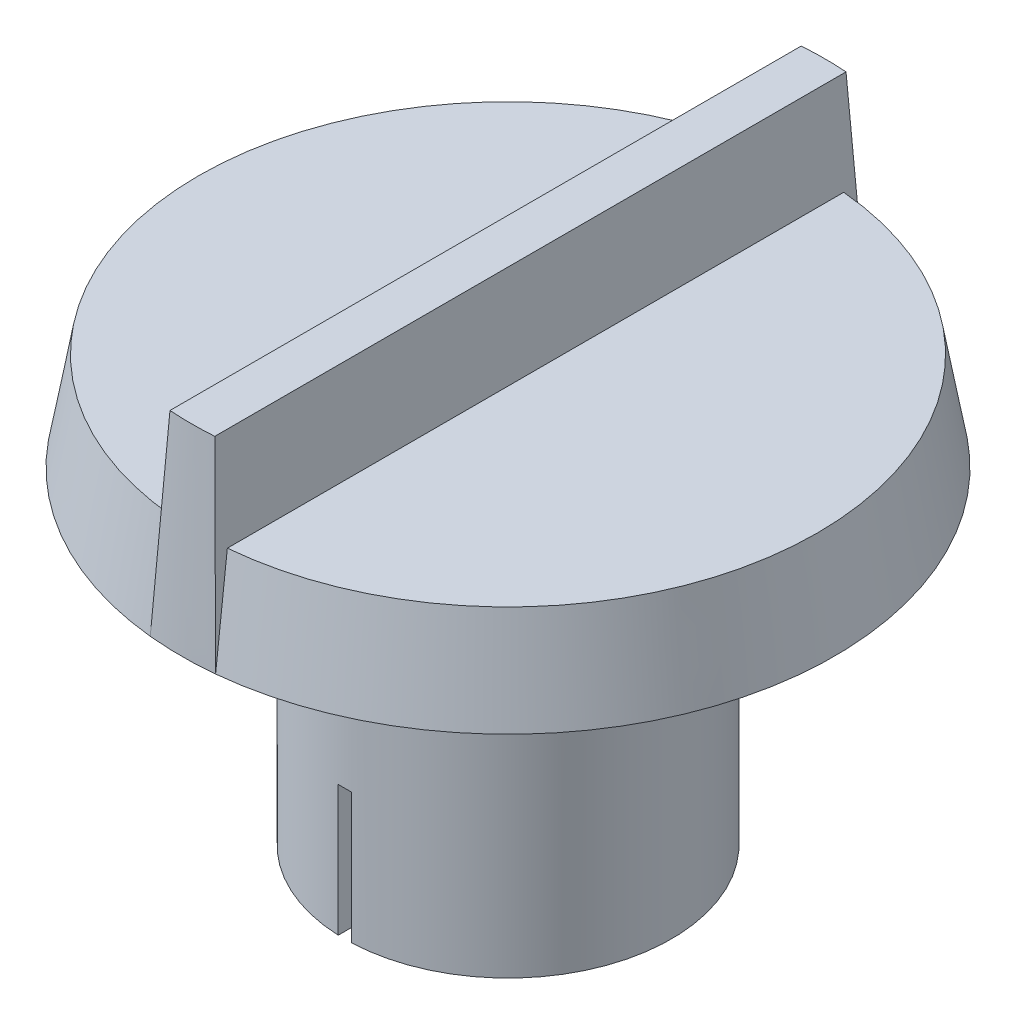
ISO-10303-21;
HEADER;
FILE_DESCRIPTION(('STEP AP214'),'2;1');
FILE_NAME('part.step','',(''),(''),'','','');
FILE_SCHEMA(('AUTOMOTIVE_DESIGN { 1 0 10303 214 1 1 1 1 }'));
ENDSEC;
DATA;
#1=APPLICATION_CONTEXT('core data for automotive mechanical design processes');
#2=APPLICATION_PROTOCOL_DEFINITION('international standard','automotive_design',2000,#1);
#3=PRODUCT_CONTEXT('',#1,'mechanical');
#4=PRODUCT('Part','Part','',(#3));
#5=PRODUCT_RELATED_PRODUCT_CATEGORY('part','',(#4));
#6=PRODUCT_DEFINITION_FORMATION('','',#4);
#7=PRODUCT_DEFINITION_CONTEXT('part definition',#1,'design');
#8=PRODUCT_DEFINITION('design','',#6,#7);
#9=PRODUCT_DEFINITION_SHAPE('','',#8);
#10=(LENGTH_UNIT() NAMED_UNIT(*) SI_UNIT(.MILLI.,.METRE.));
#11=(NAMED_UNIT(*) PLANE_ANGLE_UNIT() SI_UNIT($,.RADIAN.));
#12=(NAMED_UNIT(*) SI_UNIT($,.STERADIAN.) SOLID_ANGLE_UNIT());
#13=UNCERTAINTY_MEASURE_WITH_UNIT(LENGTH_MEASURE(1.E-05),#10,'distance_accuracy_value','');
#14=(GEOMETRIC_REPRESENTATION_CONTEXT(3) GLOBAL_UNCERTAINTY_ASSIGNED_CONTEXT((#13)) GLOBAL_UNIT_ASSIGNED_CONTEXT((#10,
#11,#12)) REPRESENTATION_CONTEXT('',''));
#15=CARTESIAN_POINT('',(0.,0.,0.));
#16=DIRECTION('',(0.,0.,1.));
#17=DIRECTION('',(1.,0.,0.));
#18=AXIS2_PLACEMENT_3D('',#15,#16,#17);
#19=CARTESIAN_POINT('',(0.,-6.,0.));
#20=DIRECTION('',(0.,1.,0.));
#21=DIRECTION('',(0.,0.,1.));
#22=AXIS2_PLACEMENT_3D('',#19,#20,#21);
#23=PLANE('',#22);
#24=DIRECTION('',(0.,0.,1.));
#25=VECTOR('',#24,1.);
#26=CARTESIAN_POINT('',(-0.2,-6.,0.));
#27=LINE('',#26,#25);
#28=CARTESIAN_POINT('',(-0.2,-6.,2.99332590941915));
#29=VERTEX_POINT('',#28);
#30=CARTESIAN_POINT('',(-0.2,-6.,4.99599839871872));
#31=VERTEX_POINT('',#30);
#32=EDGE_CURVE('E176',#29,#31,#27,.T.);
#33=ORIENTED_EDGE('',*,*,#32,.F.);
#34=CARTESIAN_POINT('',(0.,-6.,0.));
#35=DIRECTION('',(0.,1.,0.));
#36=DIRECTION('',(0.,0.,1.));
#37=AXIS2_PLACEMENT_3D('',#34,#35,#36);
#38=CIRCLE('',#37,3.);
#39=CARTESIAN_POINT('',(0.2,-6.,2.99332590941915));
#40=VERTEX_POINT('',#39);
#41=EDGE_CURVE('E209',#29,#40,#38,.T.);
#42=ORIENTED_EDGE('',*,*,#41,.T.);
#43=DIRECTION('',(0.,0.,-1.));
#44=VECTOR('',#43,1.);
#45=CARTESIAN_POINT('',(0.2,-6.,0.));
#46=LINE('',#45,#44);
#47=CARTESIAN_POINT('',(0.2,-6.,4.99599839871872));
#48=VERTEX_POINT('',#47);
#49=EDGE_CURVE('E192',#48,#40,#46,.T.);
#50=ORIENTED_EDGE('',*,*,#49,.F.);
#51=CARTESIAN_POINT('',(0.,-6.,0.));
#52=DIRECTION('',(0.,1.,0.));
#53=DIRECTION('',(0.,0.,1.));
#54=AXIS2_PLACEMENT_3D('',#51,#52,#53);
#55=CIRCLE('',#54,5.);
#56=EDGE_CURVE('E55',#31,#48,#55,.T.);
#57=ORIENTED_EDGE('',*,*,#56,.F.);
#58=EDGE_LOOP('',(#33,#42,#50,#57));
#59=FACE_BOUND('',#58,.T.);
#60=ADVANCED_FACE('F39',(#59),#23,.F.);
#61=DIRECTION('',(0.,0.,1.));
#62=VECTOR('',#61,1.);
#63=CARTESIAN_POINT('',(-0.2,-6.,0.));
#64=LINE('',#63,#62);
#65=CARTESIAN_POINT('',(-0.2,-6.,-4.99599839871872));
#66=VERTEX_POINT('',#65);
#67=CARTESIAN_POINT('',(-0.2,-6.,-2.99332590941915));
#68=VERTEX_POINT('',#67);
#69=EDGE_CURVE('E63',#66,#68,#64,.T.);
#70=ORIENTED_EDGE('',*,*,#69,.F.);
#71=CARTESIAN_POINT('',(0.2,-6.,-4.99599839871872));
#72=VERTEX_POINT('',#71);
#73=EDGE_CURVE('E207',#72,#66,#55,.T.);
#74=ORIENTED_EDGE('',*,*,#73,.F.);
#75=DIRECTION('',(0.,0.,-1.));
#76=VECTOR('',#75,1.);
#77=CARTESIAN_POINT('',(0.2,-6.,0.));
#78=LINE('',#77,#76);
#79=CARTESIAN_POINT('',(0.2,-6.,-2.99332590941915));
#80=VERTEX_POINT('',#79);
#81=EDGE_CURVE('E203',#80,#72,#78,.T.);
#82=ORIENTED_EDGE('',*,*,#81,.F.);
#83=EDGE_CURVE('E210',#80,#68,#38,.T.);
#84=ORIENTED_EDGE('',*,*,#83,.T.);
#85=EDGE_LOOP('',(#70,#74,#82,#84));
#86=FACE_BOUND('',#85,.T.);
#87=ADVANCED_FACE('F348',(#86),#23,.F.);
#88=CARTESIAN_POINT('',(0.,0.,0.));
#89=DIRECTION('',(0.,-1.,0.));
#90=DIRECTION('',(0.,0.,1.));
#91=AXIS2_PLACEMENT_3D('',#88,#89,#90);
#92=CONICAL_SURFACE('',#91,10.,0.174532925199433);
#93=CARTESIAN_POINT('',(0.,3.,0.));
#94=DIRECTION('',(0.,1.,0.));
#95=DIRECTION('',(0.,0.,1.));
#96=AXIS2_PLACEMENT_3D('',#93,#94,#95);
#97=CIRCLE('',#96,9.4710190578746);
#98=CARTESIAN_POINT('',(0.842776662150876,3.,9.43344738111989));
#99=VERTEX_POINT('',#98);
#100=CARTESIAN_POINT('',(0.842776662150876,3.,-9.43344738111989));
#101=VERTEX_POINT('',#100);
#102=EDGE_CURVE('E48',#99,#101,#97,.T.);
#103=ORIENTED_EDGE('',*,*,#102,.F.);
#104=CARTESIAN_POINT('',(0.84276618059502,3.0002,9.43341291167916));
#105=CARTESIAN_POINT('',(0.868972692620578,2.50014996193173,9.51959241721835));
#106=CARTESIAN_POINT('',(0.895179640383424,2.00009160950071,9.60572349074932));
#107=CARTESIAN_POINT('',(0.94759440737037,0.999958276167367,9.77788877375103));
#108=CARTESIAN_POINT('',(0.97380222659447,0.499883295265056,9.86392298322182));
#109=CARTESIAN_POINT('',(1.00001048155586,-0.000199999999999216,9.94990876068444));
#110=B_SPLINE_CURVE_WITH_KNOTS('',3,(#104,#105,#106,#107,#108,#109),.UNSPECIFIED.,.F.,.F.,(4,2,
4),(0.,1.52429442561863,3.04858885046238),.UNSPECIFIED.);
#111=CARTESIAN_POINT('',(1.,0.,9.9498743710662));
#112=VERTEX_POINT('',#111);
#113=EDGE_CURVE('E294',#99,#112,#110,.T.);
#114=ORIENTED_EDGE('',*,*,#113,.T.);
#115=CARTESIAN_POINT('',(0.,0.,0.));
#116=DIRECTION('',(0.,1.,0.));
#117=DIRECTION('',(0.,0.,1.));
#118=AXIS2_PLACEMENT_3D('',#115,#116,#117);
#119=CIRCLE('',#118,10.);
#120=CARTESIAN_POINT('',(1.,0.,-9.9498743710662));
#121=VERTEX_POINT('',#120);
#122=EDGE_CURVE('E302',#112,#121,#119,.T.);
#123=ORIENTED_EDGE('',*,*,#122,.T.);
#124=CARTESIAN_POINT('',(1.00001048155586,-0.0002,-9.94990876068444));
#125=CARTESIAN_POINT('',(0.97380222659447,0.499883295265056,-9.86392298322183));
#126=CARTESIAN_POINT('',(0.94759440737037,0.999958276167367,-9.77788877375103));
#127=CARTESIAN_POINT('',(0.895179640383424,2.00009160950071,-9.60572349074932));
#128=CARTESIAN_POINT('',(0.868972692620578,2.50014996193173,-9.51959241721835));
#129=CARTESIAN_POINT('',(0.84276618059502,3.0002,-9.43341291167916));
#130=B_SPLINE_CURVE_WITH_KNOTS('',3,(#124,#125,#126,#127,#128,#129),.UNSPECIFIED.,.F.,.F.,(4,2,
4),(0.,1.52429442484375,3.04858885046238),.UNSPECIFIED.);
#131=EDGE_CURVE('E288',#121,#101,#130,.T.);
#132=ORIENTED_EDGE('',*,*,#131,.T.);
#133=EDGE_LOOP('',(#103,#114,#123,#132));
#134=FACE_BOUND('',#133,.T.);
#135=ADVANCED_FACE('F353',(#134),#92,.T.);
#136=CARTESIAN_POINT('',(0.,3.,0.));
#137=DIRECTION('',(0.,1.,0.));
#138=DIRECTION('',(0.,0.,1.));
#139=AXIS2_PLACEMENT_3D('',#136,#137,#138);
#140=PLANE('',#139);
#141=DIRECTION('',(0.,0.,-1.));
#142=VECTOR('',#141,1.);
#143=CARTESIAN_POINT('',(0.842776662150876,3.,0.));
#144=LINE('',#143,#142);
#145=EDGE_CURVE('E285',#99,#101,#144,.T.);
#146=ORIENTED_EDGE('',*,*,#145,.F.);
#147=ORIENTED_EDGE('',*,*,#102,.T.);
#148=EDGE_LOOP('',(#146,#147));
#149=FACE_BOUND('',#148,.T.);
#150=ADVANCED_FACE('F376',(#149),#140,.T.);
#151=CARTESIAN_POINT('',(-0.842776662150876,3.,-9.43344738111989));
#152=VERTEX_POINT('',#151);
#153=CARTESIAN_POINT('',(-0.842776662150876,3.,9.43344738111989));
#154=VERTEX_POINT('',#153);
#155=EDGE_CURVE('E304',#152,#154,#97,.T.);
#156=ORIENTED_EDGE('',*,*,#155,.F.);
#157=CARTESIAN_POINT('',(-0.84276618059502,3.0002,-9.43341291167916));
#158=CARTESIAN_POINT('',(-0.868972692620578,2.50014996193173,-9.51959241721835));
#159=CARTESIAN_POINT('',(-0.895179640383424,2.00009160950071,-9.60572349074932));
#160=CARTESIAN_POINT('',(-0.94759440737037,0.999958276167367,-9.77788877375103));
#161=CARTESIAN_POINT('',(-0.97380222659447,0.499883295265056,-9.86392298322182));
#162=CARTESIAN_POINT('',(-1.00001048155586,-0.000199999999999216,-9.94990876068444));
#163=B_SPLINE_CURVE_WITH_KNOTS('',3,(#157,#158,#159,#160,#161,#162),.UNSPECIFIED.,.F.,.F.,(4,2,
4),(0.,1.52429442561863,3.04858885046238),.UNSPECIFIED.);
#164=CARTESIAN_POINT('',(-0.999999999999999,0.,-9.9498743710662));
#165=VERTEX_POINT('',#164);
#166=EDGE_CURVE('E278',#152,#165,#163,.T.);
#167=ORIENTED_EDGE('',*,*,#166,.T.);
#168=CARTESIAN_POINT('',(-1.,0.,9.9498743710662));
#169=VERTEX_POINT('',#168);
#170=EDGE_CURVE('E301',#165,#169,#119,.T.);
#171=ORIENTED_EDGE('',*,*,#170,.T.);
#172=CARTESIAN_POINT('',(-1.00001048155586,-0.0002,9.94990876068444));
#173=CARTESIAN_POINT('',(-0.97380222659447,0.499883295265056,9.86392298322183));
#174=CARTESIAN_POINT('',(-0.94759440737037,0.999958276167367,9.77788877375103));
#175=CARTESIAN_POINT('',(-0.895179640383424,2.00009160950071,9.60572349074932));
#176=CARTESIAN_POINT('',(-0.868972692620578,2.50014996193173,9.51959241721835));
#177=CARTESIAN_POINT('',(-0.84276618059502,3.0002,9.43341291167916));
#178=B_SPLINE_CURVE_WITH_KNOTS('',3,(#172,#173,#174,#175,#176,#177),.UNSPECIFIED.,.F.,.F.,(4,2,
4),(0.,1.52429442484375,3.04858885046238),.UNSPECIFIED.);
#179=EDGE_CURVE('E272',#169,#154,#178,.T.);
#180=ORIENTED_EDGE('',*,*,#179,.T.);
#181=EDGE_LOOP('',(#156,#167,#171,#180));
#182=FACE_BOUND('',#181,.T.);
#183=ADVANCED_FACE('F41',(#182),#92,.T.);
#184=DIRECTION('',(0.,0.,1.));
#185=VECTOR('',#184,1.);
#186=CARTESIAN_POINT('',(-0.842776662150876,3.,0.));
#187=LINE('',#186,#185);
#188=EDGE_CURVE('E227',#152,#154,#187,.T.);
#189=ORIENTED_EDGE('',*,*,#188,.F.);
#190=ORIENTED_EDGE('',*,*,#155,.T.);
#191=EDGE_LOOP('',(#189,#190));
#192=FACE_BOUND('',#191,.T.);
#193=ADVANCED_FACE('F266',(#192),#140,.T.);
#194=CARTESIAN_POINT('',(0.,0.,0.));
#195=DIRECTION('',(0.,1.,0.));
#196=DIRECTION('',(0.,0.,1.));
#197=AXIS2_PLACEMENT_3D('',#194,#195,#196);
#198=PLANE('',#197);
#199=CARTESIAN_POINT('',(0.,0.,0.));
#200=DIRECTION('',(0.,1.,0.));
#201=DIRECTION('',(0.,0.,1.));
#202=AXIS2_PLACEMENT_3D('',#199,#200,#201);
#203=CIRCLE('',#202,5.);
#204=CARTESIAN_POINT('',(0.,0.,5.));
#205=VERTEX_POINT('',#204);
#206=EDGE_CURVE('E206',#205,#205,#203,.T.);
#207=ORIENTED_EDGE('',*,*,#206,.T.);
#208=EDGE_LOOP('',(#207));
#209=FACE_BOUND('',#208,.T.);
#210=ORIENTED_EDGE('',*,*,#170,.F.);
#211=CARTESIAN_POINT('',(0.,0.,0.));
#212=DIRECTION('',(0.,1.,0.));
#213=DIRECTION('',(0.,0.,1.));
#214=AXIS2_PLACEMENT_3D('',#211,#212,#213);
#215=CIRCLE('',#214,10.);
#216=EDGE_CURVE('E212',#121,#165,#215,.T.);
#217=ORIENTED_EDGE('',*,*,#216,.F.);
#218=ORIENTED_EDGE('',*,*,#122,.F.);
#219=EDGE_CURVE('E217',#169,#112,#215,.T.);
#220=ORIENTED_EDGE('',*,*,#219,.F.);
#221=EDGE_LOOP('',(#210,#217,#218,#220));
#222=FACE_BOUND('',#221,.T.);
#223=ADVANCED_FACE('F321',(#209,#222),#198,.F.);
#224=CARTESIAN_POINT('',(1.,0.,0.));
#225=DIRECTION('',(0.998629534754574,0.0523359562429439,0.));
#226=DIRECTION('',(-0.0523359562429439,0.998629534754574,0.));
#227=AXIS2_PLACEMENT_3D('',#224,#225,#226);
#228=PLANE('',#227);
#229=ORIENTED_EDGE('',*,*,#113,.F.);
#230=ORIENTED_EDGE('',*,*,#145,.T.);
#231=ORIENTED_EDGE('',*,*,#131,.F.);
#232=CARTESIAN_POINT('',(0.685553324301753,6.,-9.66126077887516));
#233=CARTESIAN_POINT('',(0.737959328169274,5.00003387694622,-9.71006928932409));
#234=CARTESIAN_POINT('',(0.790366219796613,4.000050814426,-9.75852467727821));
#235=CARTESIAN_POINT('',(0.895181778362702,2.00005081442586,-9.85472920800575));
#236=CARTESIAN_POINT('',(0.947590445301446,1.00003387694608,-9.90247835078197));
#237=CARTESIAN_POINT('',(1.,0.,-9.9498743710662));
#238=B_SPLINE_CURVE_WITH_KNOTS('',3,(#232,#233,#234,#235,#236,#237),.UNSPECIFIED.,.F.,.F.,(4,2,
4),(0.,3.00758121921124,6.0151624264729),.UNSPECIFIED.);
#239=CARTESIAN_POINT('',(0.685553324301753,6.,-9.66126077887516));
#240=VERTEX_POINT('',#239);
#241=EDGE_CURVE('E218',#240,#121,#238,.T.);
#242=ORIENTED_EDGE('',*,*,#241,.F.);
#243=DIRECTION('',(0.,0.,1.));
#244=VECTOR('',#243,1.);
#245=CARTESIAN_POINT('',(0.685553324301753,6.,0.));
#246=LINE('',#245,#244);
#247=CARTESIAN_POINT('',(0.685553324301753,6.,9.66126077887516));
#248=VERTEX_POINT('',#247);
#249=EDGE_CURVE('E260',#240,#248,#246,.T.);
#250=ORIENTED_EDGE('',*,*,#249,.T.);
#251=CARTESIAN_POINT('',(0.685553324301753,6.,9.66126077887516));
#252=CARTESIAN_POINT('',(0.737959328169274,5.00003387694622,9.71006928932409));
#253=CARTESIAN_POINT('',(0.790366219796613,4.000050814426,9.75852467727821));
#254=CARTESIAN_POINT('',(0.895181778362702,2.00005081442586,9.85472920800575));
#255=CARTESIAN_POINT('',(0.947590445301446,1.00003387694608,9.90247835078197));
#256=CARTESIAN_POINT('',(1.,0.,9.9498743710662));
#257=B_SPLINE_CURVE_WITH_KNOTS('',3,(#251,#252,#253,#254,#255,#256),.UNSPECIFIED.,.F.,.F.,(4,2,
4),(0.,3.00758121921124,6.0151624264729),.UNSPECIFIED.);
#258=EDGE_CURVE('E229',#248,#112,#257,.T.);
#259=ORIENTED_EDGE('',*,*,#258,.T.);
#260=EDGE_LOOP('',(#229,#230,#231,#242,#250,#259));
#261=FACE_BOUND('',#260,.T.);
#262=ADVANCED_FACE('F236',(#261),#228,.T.);
#263=CARTESIAN_POINT('',(-1.,0.,0.));
#264=DIRECTION('',(-0.998629534754574,0.0523359562429439,0.));
#265=DIRECTION('',(-0.0523359562429439,-0.998629534754574,0.));
#266=AXIS2_PLACEMENT_3D('',#263,#264,#265);
#267=PLANE('',#266);
#268=ORIENTED_EDGE('',*,*,#166,.F.);
#269=ORIENTED_EDGE('',*,*,#188,.T.);
#270=ORIENTED_EDGE('',*,*,#179,.F.);
#271=CARTESIAN_POINT('',(-0.685553324301753,6.,9.66126077887516));
#272=CARTESIAN_POINT('',(-0.737959328169274,5.00003387694622,9.71006928932409));
#273=CARTESIAN_POINT('',(-0.790366219796613,4.000050814426,9.75852467727821));
#274=CARTESIAN_POINT('',(-0.895181778362702,2.00005081442586,9.85472920800575));
#275=CARTESIAN_POINT('',(-0.947590445301446,1.00003387694608,9.90247835078197));
#276=CARTESIAN_POINT('',(-1.,0.,9.9498743710662));
#277=B_SPLINE_CURVE_WITH_KNOTS('',3,(#271,#272,#273,#274,#275,#276),.UNSPECIFIED.,.F.,.F.,(4,2,
4),(0.,3.00758121921124,6.0151624264729),.UNSPECIFIED.);
#278=CARTESIAN_POINT('',(-0.685553324301753,6.,9.66126077887516));
#279=VERTEX_POINT('',#278);
#280=EDGE_CURVE('E255',#279,#169,#277,.T.);
#281=ORIENTED_EDGE('',*,*,#280,.F.);
#282=DIRECTION('',(0.,0.,-1.));
#283=VECTOR('',#282,1.);
#284=CARTESIAN_POINT('',(-0.685553324301753,6.,0.));
#285=LINE('',#284,#283);
#286=CARTESIAN_POINT('',(-0.685553324301753,6.,-9.66126077887516));
#287=VERTEX_POINT('',#286);
#288=EDGE_CURVE('E330',#279,#287,#285,.T.);
#289=ORIENTED_EDGE('',*,*,#288,.T.);
#290=CARTESIAN_POINT('',(-0.685553324301753,6.,-9.66126077887516));
#291=CARTESIAN_POINT('',(-0.737959328169274,5.00003387694622,-9.71006928932409));
#292=CARTESIAN_POINT('',(-0.790366219796613,4.000050814426,-9.75852467727821));
#293=CARTESIAN_POINT('',(-0.895181778362702,2.00005081442586,-9.85472920800575));
#294=CARTESIAN_POINT('',(-0.947590445301446,1.00003387694608,-9.90247835078197));
#295=CARTESIAN_POINT('',(-1.,0.,-9.9498743710662));
#296=B_SPLINE_CURVE_WITH_KNOTS('',3,(#290,#291,#292,#293,#294,#295),.UNSPECIFIED.,.F.,.F.,(4,2,
4),(0.,3.00758121921124,6.0151624264729),.UNSPECIFIED.);
#297=EDGE_CURVE('E228',#287,#165,#296,.T.);
#298=ORIENTED_EDGE('',*,*,#297,.T.);
#299=EDGE_LOOP('',(#268,#269,#270,#281,#289,#298));
#300=FACE_BOUND('',#299,.T.);
#301=ADVANCED_FACE('F243',(#300),#267,.T.);
#302=CARTESIAN_POINT('',(0.,0.,0.));
#303=DIRECTION('',(0.,-1.,0.));
#304=DIRECTION('',(0.,0.,1.));
#305=AXIS2_PLACEMENT_3D('',#302,#303,#304);
#306=CONICAL_SURFACE('',#305,10.,0.0523598775598299);
#307=ORIENTED_EDGE('',*,*,#216,.T.);
#308=ORIENTED_EDGE('',*,*,#297,.F.);
#309=CARTESIAN_POINT('',(0.,6.,0.));
#310=DIRECTION('',(0.,1.,0.));
#311=DIRECTION('',(0.,0.,1.));
#312=AXIS2_PLACEMENT_3D('',#309,#310,#311);
#313=CIRCLE('',#312,9.68555332430175);
#314=EDGE_CURVE('E326',#240,#287,#313,.T.);
#315=ORIENTED_EDGE('',*,*,#314,.F.);
#316=ORIENTED_EDGE('',*,*,#241,.T.);
#317=EDGE_LOOP('',(#307,#308,#315,#316));
#318=FACE_BOUND('',#317,.T.);
#319=ADVANCED_FACE('F239',(#318),#306,.T.);
#320=CARTESIAN_POINT('',(0.,0.,0.));
#321=DIRECTION('',(0.,-1.,0.));
#322=DIRECTION('',(0.,0.,1.));
#323=AXIS2_PLACEMENT_3D('',#320,#321,#322);
#324=CONICAL_SURFACE('',#323,10.,0.0523598775598299);
#325=ORIENTED_EDGE('',*,*,#219,.T.);
#326=ORIENTED_EDGE('',*,*,#258,.F.);
#327=CARTESIAN_POINT('',(0.,6.,0.));
#328=DIRECTION('',(0.,1.,0.));
#329=DIRECTION('',(0.,0.,1.));
#330=AXIS2_PLACEMENT_3D('',#327,#328,#329);
#331=CIRCLE('',#330,9.68555332430175);
#332=EDGE_CURVE('E334',#279,#248,#331,.T.);
#333=ORIENTED_EDGE('',*,*,#332,.F.);
#334=ORIENTED_EDGE('',*,*,#280,.T.);
#335=EDGE_LOOP('',(#325,#326,#333,#334));
#336=FACE_BOUND('',#335,.T.);
#337=ADVANCED_FACE('F242',(#336),#324,.T.);
#338=CARTESIAN_POINT('',(0.,6.,0.));
#339=DIRECTION('',(0.,1.,0.));
#340=DIRECTION('',(0.,0.,1.));
#341=AXIS2_PLACEMENT_3D('',#338,#339,#340);
#342=PLANE('',#341);
#343=ORIENTED_EDGE('',*,*,#249,.F.);
#344=ORIENTED_EDGE('',*,*,#314,.T.);
#345=ORIENTED_EDGE('',*,*,#288,.F.);
#346=ORIENTED_EDGE('',*,*,#332,.T.);
#347=EDGE_LOOP('',(#343,#344,#345,#346));
#348=FACE_BOUND('',#347,.T.);
#349=ADVANCED_FACE('F338',(#348),#342,.T.);
#350=CARTESIAN_POINT('',(0.,-6.,0.));
#351=DIRECTION('',(0.,1.,0.));
#352=DIRECTION('',(0.,0.,1.));
#353=AXIS2_PLACEMENT_3D('',#350,#351,#352);
#354=CYLINDRICAL_SURFACE('',#353,5.);
#355=ORIENTED_EDGE('',*,*,#73,.T.);
#356=DIRECTION('',(0.,1.,0.));
#357=VECTOR('',#356,1.);
#358=CARTESIAN_POINT('',(-0.2,-10.,-4.99599839871872));
#359=LINE('',#358,#357);
#360=CARTESIAN_POINT('',(-0.2,-10.,-4.99599839871872));
#361=VERTEX_POINT('',#360);
#362=EDGE_CURVE('E158',#361,#66,#359,.T.);
#363=ORIENTED_EDGE('',*,*,#362,.F.);
#364=CARTESIAN_POINT('',(0.,-10.,0.));
#365=DIRECTION('',(0.,1.,0.));
#366=DIRECTION('',(0.,0.,1.));
#367=AXIS2_PLACEMENT_3D('',#364,#365,#366);
#368=CIRCLE('',#367,5.);
#369=CARTESIAN_POINT('',(-0.2,-10.,4.99599839871872));
#370=VERTEX_POINT('',#369);
#371=EDGE_CURVE('E149',#361,#370,#368,.T.);
#372=ORIENTED_EDGE('',*,*,#371,.T.);
#373=DIRECTION('',(0.,1.,0.));
#374=VECTOR('',#373,1.);
#375=CARTESIAN_POINT('',(-0.2,-10.,4.99599839871872));
#376=LINE('',#375,#374);
#377=EDGE_CURVE('E171',#370,#31,#376,.T.);
#378=ORIENTED_EDGE('',*,*,#377,.T.);
#379=ORIENTED_EDGE('',*,*,#56,.T.);
#380=DIRECTION('',(0.,1.,0.));
#381=VECTOR('',#380,1.);
#382=CARTESIAN_POINT('',(0.2,-10.,4.99599839871872));
#383=LINE('',#382,#381);
#384=CARTESIAN_POINT('',(0.2,-10.,4.99599839871872));
#385=VERTEX_POINT('',#384);
#386=EDGE_CURVE('E196',#385,#48,#383,.T.);
#387=ORIENTED_EDGE('',*,*,#386,.F.);
#388=CARTESIAN_POINT('',(0.,-10.,0.));
#389=DIRECTION('',(0.,1.,0.));
#390=DIRECTION('',(0.,0.,1.));
#391=AXIS2_PLACEMENT_3D('',#388,#389,#390);
#392=CIRCLE('',#391,5.);
#393=CARTESIAN_POINT('',(0.2,-10.,-4.99599839871872));
#394=VERTEX_POINT('',#393);
#395=EDGE_CURVE('E183',#385,#394,#392,.T.);
#396=ORIENTED_EDGE('',*,*,#395,.T.);
#397=DIRECTION('',(0.,1.,0.));
#398=VECTOR('',#397,1.);
#399=CARTESIAN_POINT('',(0.2,-10.,-4.99599839871872));
#400=LINE('',#399,#398);
#401=EDGE_CURVE('E193',#394,#72,#400,.T.);
#402=ORIENTED_EDGE('',*,*,#401,.T.);
#403=EDGE_LOOP('',(#355,#363,#372,#378,#379,#387,#396,#402));
#404=FACE_BOUND('',#403,.T.);
#405=ORIENTED_EDGE('',*,*,#206,.F.);
#406=EDGE_LOOP('',(#405));
#407=FACE_BOUND('',#406,.T.);
#408=ADVANCED_FACE('F340',(#404,#407),#354,.T.);
#409=CARTESIAN_POINT('',(0.,-6.,0.));
#410=DIRECTION('',(0.,1.,0.));
#411=DIRECTION('',(0.,0.,1.));
#412=AXIS2_PLACEMENT_3D('',#409,#410,#411);
#413=CYLINDRICAL_SURFACE('',#412,3.);
#414=ORIENTED_EDGE('',*,*,#41,.F.);
#415=DIRECTION('',(0.,1.,0.));
#416=VECTOR('',#415,1.);
#417=CARTESIAN_POINT('',(-0.2,-10.,2.99332590941915));
#418=LINE('',#417,#416);
#419=CARTESIAN_POINT('',(-0.2,-10.,2.99332590941915));
#420=VERTEX_POINT('',#419);
#421=EDGE_CURVE('E165',#420,#29,#418,.T.);
#422=ORIENTED_EDGE('',*,*,#421,.F.);
#423=CARTESIAN_POINT('',(0.,-10.,0.));
#424=DIRECTION('',(0.,1.,0.));
#425=DIRECTION('',(0.,0.,1.));
#426=AXIS2_PLACEMENT_3D('',#423,#424,#425);
#427=CIRCLE('',#426,3.);
#428=CARTESIAN_POINT('',(-0.2,-10.,-2.99332590941915));
#429=VERTEX_POINT('',#428);
#430=EDGE_CURVE('E146',#429,#420,#427,.T.);
#431=ORIENTED_EDGE('',*,*,#430,.F.);
#432=DIRECTION('',(0.,1.,0.));
#433=VECTOR('',#432,1.);
#434=CARTESIAN_POINT('',(-0.2,-10.,-2.99332590941915));
#435=LINE('',#434,#433);
#436=EDGE_CURVE('E154',#429,#68,#435,.T.);
#437=ORIENTED_EDGE('',*,*,#436,.T.);
#438=ORIENTED_EDGE('',*,*,#83,.F.);
#439=DIRECTION('',(0.,1.,0.));
#440=VECTOR('',#439,1.);
#441=CARTESIAN_POINT('',(0.2,-10.,-2.99332590941915));
#442=LINE('',#441,#440);
#443=CARTESIAN_POINT('',(0.2,-10.,-2.99332590941915));
#444=VERTEX_POINT('',#443);
#445=EDGE_CURVE('E189',#444,#80,#442,.T.);
#446=ORIENTED_EDGE('',*,*,#445,.F.);
#447=CARTESIAN_POINT('',(0.,-10.,0.));
#448=DIRECTION('',(0.,1.,0.));
#449=DIRECTION('',(0.,0.,1.));
#450=AXIS2_PLACEMENT_3D('',#447,#448,#449);
#451=CIRCLE('',#450,3.);
#452=CARTESIAN_POINT('',(0.2,-10.,2.99332590941915));
#453=VERTEX_POINT('',#452);
#454=EDGE_CURVE('E178',#453,#444,#451,.T.);
#455=ORIENTED_EDGE('',*,*,#454,.F.);
#456=DIRECTION('',(0.,1.,0.));
#457=VECTOR('',#456,1.);
#458=CARTESIAN_POINT('',(0.2,-10.,2.99332590941915));
#459=LINE('',#458,#457);
#460=EDGE_CURVE('E188',#453,#40,#459,.T.);
#461=ORIENTED_EDGE('',*,*,#460,.T.);
#462=EDGE_LOOP('',(#414,#422,#431,#437,#438,#446,#455,#461));
#463=FACE_BOUND('',#462,.T.);
#464=CARTESIAN_POINT('',(0.,0.,0.));
#465=DIRECTION('',(0.,1.,0.));
#466=DIRECTION('',(0.,0.,1.));
#467=AXIS2_PLACEMENT_3D('',#464,#465,#466);
#468=CIRCLE('',#467,3.);
#469=CARTESIAN_POINT('',(0.,0.,3.));
#470=VERTEX_POINT('',#469);
#471=EDGE_CURVE('E11',#470,#470,#468,.T.);
#472=ORIENTED_EDGE('',*,*,#471,.T.);
#473=EDGE_LOOP('',(#472));
#474=FACE_BOUND('',#473,.T.);
#475=ADVANCED_FACE('F162',(#463,#474),#413,.F.);
#476=ORIENTED_EDGE('',*,*,#471,.F.);
#477=EDGE_LOOP('',(#476));
#478=FACE_BOUND('',#477,.T.);
#479=ADVANCED_FACE('F359',(#478),#198,.F.);
#480=CARTESIAN_POINT('',(0.2,-10.,0.));
#481=DIRECTION('',(1.,0.,0.));
#482=DIRECTION('',(0.,0.,-1.));
#483=AXIS2_PLACEMENT_3D('',#480,#481,#482);
#484=PLANE('',#483);
#485=ORIENTED_EDGE('',*,*,#445,.T.);
#486=ORIENTED_EDGE('',*,*,#81,.T.);
#487=ORIENTED_EDGE('',*,*,#401,.F.);
#488=DIRECTION('',(0.,0.,-1.));
#489=VECTOR('',#488,1.);
#490=CARTESIAN_POINT('',(0.2,-10.,0.));
#491=LINE('',#490,#489);
#492=EDGE_CURVE('E186',#444,#394,#491,.T.);
#493=ORIENTED_EDGE('',*,*,#492,.F.);
#494=EDGE_LOOP('',(#485,#486,#487,#493));
#495=FACE_BOUND('',#494,.T.);
#496=ADVANCED_FACE('F363',(#495),#484,.F.);
#497=CARTESIAN_POINT('',(0.2,-10.,0.));
#498=DIRECTION('',(1.,0.,0.));
#499=DIRECTION('',(0.,0.,-1.));
#500=AXIS2_PLACEMENT_3D('',#497,#498,#499);
#501=PLANE('',#500);
#502=ORIENTED_EDGE('',*,*,#386,.T.);
#503=ORIENTED_EDGE('',*,*,#49,.T.);
#504=ORIENTED_EDGE('',*,*,#460,.F.);
#505=DIRECTION('',(0.,0.,-1.));
#506=VECTOR('',#505,1.);
#507=CARTESIAN_POINT('',(0.2,-10.,0.));
#508=LINE('',#507,#506);
#509=EDGE_CURVE('E181',#385,#453,#508,.T.);
#510=ORIENTED_EDGE('',*,*,#509,.F.);
#511=EDGE_LOOP('',(#502,#503,#504,#510));
#512=FACE_BOUND('',#511,.T.);
#513=ADVANCED_FACE('F356',(#512),#501,.F.);
#514=CARTESIAN_POINT('',(0.,-10.,0.));
#515=DIRECTION('',(0.,1.,0.));
#516=DIRECTION('',(0.,0.,1.));
#517=AXIS2_PLACEMENT_3D('',#514,#515,#516);
#518=PLANE('',#517);
#519=ORIENTED_EDGE('',*,*,#454,.T.);
#520=ORIENTED_EDGE('',*,*,#492,.T.);
#521=ORIENTED_EDGE('',*,*,#395,.F.);
#522=ORIENTED_EDGE('',*,*,#509,.T.);
#523=EDGE_LOOP('',(#519,#520,#521,#522));
#524=FACE_BOUND('',#523,.T.);
#525=ADVANCED_FACE('F437',(#524),#518,.F.);
#526=CARTESIAN_POINT('',(-0.2,-10.,0.));
#527=DIRECTION('',(-1.,0.,0.));
#528=DIRECTION('',(0.,0.,1.));
#529=AXIS2_PLACEMENT_3D('',#526,#527,#528);
#530=PLANE('',#529);
#531=ORIENTED_EDGE('',*,*,#421,.T.);
#532=ORIENTED_EDGE('',*,*,#32,.T.);
#533=ORIENTED_EDGE('',*,*,#377,.F.);
#534=DIRECTION('',(0.,0.,1.));
#535=VECTOR('',#534,1.);
#536=CARTESIAN_POINT('',(-0.2,-10.,0.));
#537=LINE('',#536,#535);
#538=EDGE_CURVE('E159',#420,#370,#537,.T.);
#539=ORIENTED_EDGE('',*,*,#538,.F.);
#540=EDGE_LOOP('',(#531,#532,#533,#539));
#541=FACE_BOUND('',#540,.T.);
#542=ADVANCED_FACE('F446',(#541),#530,.F.);
#543=CARTESIAN_POINT('',(-0.2,-10.,0.));
#544=DIRECTION('',(-1.,0.,0.));
#545=DIRECTION('',(0.,0.,1.));
#546=AXIS2_PLACEMENT_3D('',#543,#544,#545);
#547=PLANE('',#546);
#548=ORIENTED_EDGE('',*,*,#362,.T.);
#549=ORIENTED_EDGE('',*,*,#69,.T.);
#550=ORIENTED_EDGE('',*,*,#436,.F.);
#551=DIRECTION('',(0.,0.,1.));
#552=VECTOR('',#551,1.);
#553=CARTESIAN_POINT('',(-0.2,-10.,0.));
#554=LINE('',#553,#552);
#555=EDGE_CURVE('E142',#361,#429,#554,.T.);
#556=ORIENTED_EDGE('',*,*,#555,.F.);
#557=EDGE_LOOP('',(#548,#549,#550,#556));
#558=FACE_BOUND('',#557,.T.);
#559=ADVANCED_FACE('F155',(#558),#547,.F.);
#560=CARTESIAN_POINT('',(0.,-10.,0.));
#561=DIRECTION('',(0.,1.,0.));
#562=DIRECTION('',(0.,0.,1.));
#563=AXIS2_PLACEMENT_3D('',#560,#561,#562);
#564=PLANE('',#563);
#565=ORIENTED_EDGE('',*,*,#430,.T.);
#566=ORIENTED_EDGE('',*,*,#538,.T.);
#567=ORIENTED_EDGE('',*,*,#371,.F.);
#568=ORIENTED_EDGE('',*,*,#555,.T.);
#569=EDGE_LOOP('',(#565,#566,#567,#568));
#570=FACE_BOUND('',#569,.T.);
#571=ADVANCED_FACE('F144',(#570),#564,.F.);
#572=CLOSED_SHELL('',(#60,#87,#135,#150,#183,#193,#223,#262,#301,#319,#337,#349,#408,#475,#479,
#496,#513,#525,#542,#559,#571));
#573=MANIFOLD_SOLID_BREP('B2',#572);
#574=ADVANCED_BREP_SHAPE_REPRESENTATION('',(#18,#573),#14);
#575=SHAPE_DEFINITION_REPRESENTATION(#9,#574);
ENDSEC;
END-ISO-10303-21;
